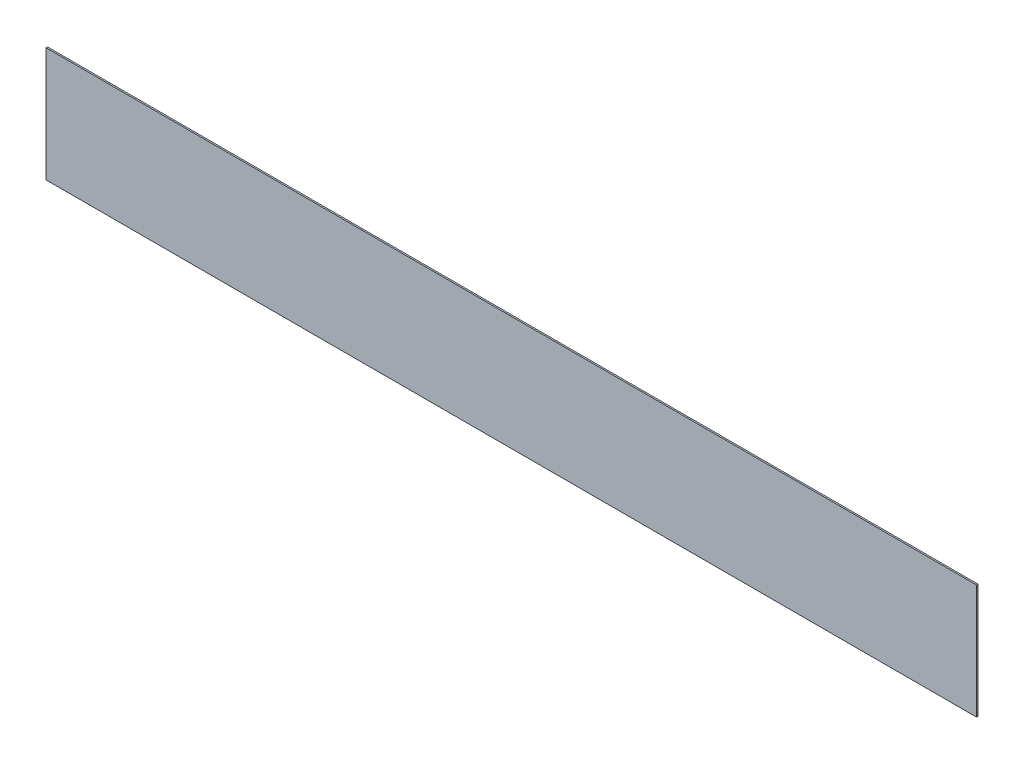
ISO-10303-21;
HEADER;
FILE_DESCRIPTION(('STEP AP214'),'2;1');
FILE_NAME('part.step','',(''),(''),'','','');
FILE_SCHEMA(('AUTOMOTIVE_DESIGN { 1 0 10303 214 1 1 1 1 }'));
ENDSEC;
DATA;
#1=APPLICATION_CONTEXT('core data for automotive mechanical design processes');
#2=APPLICATION_PROTOCOL_DEFINITION('international standard','automotive_design',2000,#1);
#3=PRODUCT_CONTEXT('',#1,'mechanical');
#4=PRODUCT('Part','Part','',(#3));
#5=PRODUCT_RELATED_PRODUCT_CATEGORY('part','',(#4));
#6=PRODUCT_DEFINITION_FORMATION('','',#4);
#7=PRODUCT_DEFINITION_CONTEXT('part definition',#1,'design');
#8=PRODUCT_DEFINITION('design','',#6,#7);
#9=PRODUCT_DEFINITION_SHAPE('','',#8);
#10=(LENGTH_UNIT() NAMED_UNIT(*) SI_UNIT(.MILLI.,.METRE.));
#11=(NAMED_UNIT(*) PLANE_ANGLE_UNIT() SI_UNIT($,.RADIAN.));
#12=(NAMED_UNIT(*) SI_UNIT($,.STERADIAN.) SOLID_ANGLE_UNIT());
#13=UNCERTAINTY_MEASURE_WITH_UNIT(LENGTH_MEASURE(1.E-05),#10,'distance_accuracy_value','');
#14=(GEOMETRIC_REPRESENTATION_CONTEXT(3) GLOBAL_UNCERTAINTY_ASSIGNED_CONTEXT((#13)) GLOBAL_UNIT_ASSIGNED_CONTEXT((#10,
#11,#12)) REPRESENTATION_CONTEXT('',''));
#15=CARTESIAN_POINT('',(0.,0.,0.));
#16=DIRECTION('',(0.,0.,1.));
#17=DIRECTION('',(1.,0.,0.));
#18=AXIS2_PLACEMENT_3D('',#15,#16,#17);
#19=CARTESIAN_POINT('',(0.,0.,1.27));
#20=DIRECTION('',(1.,0.,0.));
#21=DIRECTION('',(0.,0.,-1.));
#22=AXIS2_PLACEMENT_3D('',#19,#20,#21);
#23=PLANE('',#22);
#24=DIRECTION('',(0.,-1.,0.));
#25=VECTOR('',#24,1.);
#26=CARTESIAN_POINT('',(0.,0.,0.));
#27=LINE('',#26,#25);
#28=CARTESIAN_POINT('',(0.,100.,0.));
#29=VERTEX_POINT('',#28);
#30=CARTESIAN_POINT('',(0.,0.,0.));
#31=VERTEX_POINT('',#30);
#32=EDGE_CURVE('E102',#29,#31,#27,.T.);
#33=ORIENTED_EDGE('',*,*,#32,.T.);
#34=DIRECTION('',(0.,0.,-1.));
#35=VECTOR('',#34,1.);
#36=CARTESIAN_POINT('',(0.,0.,1.27));
#37=LINE('',#36,#35);
#38=CARTESIAN_POINT('',(0.,0.,1.27));
#39=VERTEX_POINT('',#38);
#40=EDGE_CURVE('E11',#39,#31,#37,.T.);
#41=ORIENTED_EDGE('',*,*,#40,.F.);
#42=DIRECTION('',(0.,-1.,0.));
#43=VECTOR('',#42,1.);
#44=CARTESIAN_POINT('',(0.,0.,1.27));
#45=LINE('',#44,#43);
#46=CARTESIAN_POINT('',(0.,100.,1.27));
#47=VERTEX_POINT('',#46);
#48=EDGE_CURVE('E90',#47,#39,#45,.T.);
#49=ORIENTED_EDGE('',*,*,#48,.F.);
#50=DIRECTION('',(0.,0.,-1.));
#51=VECTOR('',#50,1.);
#52=CARTESIAN_POINT('',(0.,100.,1.27));
#53=LINE('',#52,#51);
#54=EDGE_CURVE('E98',#47,#29,#53,.T.);
#55=ORIENTED_EDGE('',*,*,#54,.T.);
#56=EDGE_LOOP('',(#33,#41,#49,#55));
#57=FACE_BOUND('',#56,.T.);
#58=ADVANCED_FACE('F39',(#57),#23,.F.);
#59=CARTESIAN_POINT('',(0.,0.,1.27));
#60=DIRECTION('',(0.,1.,0.));
#61=DIRECTION('',(0.,0.,1.));
#62=AXIS2_PLACEMENT_3D('',#59,#60,#61);
#63=PLANE('',#62);
#64=DIRECTION('',(1.,0.,0.));
#65=VECTOR('',#64,1.);
#66=CARTESIAN_POINT('',(0.,0.,0.));
#67=LINE('',#66,#65);
#68=CARTESIAN_POINT('',(813.,0.,0.));
#69=VERTEX_POINT('',#68);
#70=EDGE_CURVE('E94',#31,#69,#67,.T.);
#71=ORIENTED_EDGE('',*,*,#70,.T.);
#72=DIRECTION('',(0.,0.,-1.));
#73=VECTOR('',#72,1.);
#74=CARTESIAN_POINT('',(813.,0.,1.27));
#75=LINE('',#74,#73);
#76=CARTESIAN_POINT('',(813.,0.,1.27));
#77=VERTEX_POINT('',#76);
#78=EDGE_CURVE('E47',#77,#69,#75,.T.);
#79=ORIENTED_EDGE('',*,*,#78,.F.);
#80=DIRECTION('',(1.,0.,0.));
#81=VECTOR('',#80,1.);
#82=CARTESIAN_POINT('',(0.,0.,1.27));
#83=LINE('',#82,#81);
#84=EDGE_CURVE('E85',#39,#77,#83,.T.);
#85=ORIENTED_EDGE('',*,*,#84,.F.);
#86=ORIENTED_EDGE('',*,*,#40,.T.);
#87=EDGE_LOOP('',(#71,#79,#85,#86));
#88=FACE_BOUND('',#87,.T.);
#89=ADVANCED_FACE('F93',(#88),#63,.F.);
#90=CARTESIAN_POINT('',(813.,0.,1.27));
#91=DIRECTION('',(-1.,0.,0.));
#92=DIRECTION('',(0.,0.,1.));
#93=AXIS2_PLACEMENT_3D('',#90,#91,#92);
#94=PLANE('',#93);
#95=DIRECTION('',(0.,1.,0.));
#96=VECTOR('',#95,1.);
#97=CARTESIAN_POINT('',(813.,0.,0.));
#98=LINE('',#97,#96);
#99=CARTESIAN_POINT('',(813.,100.,0.));
#100=VERTEX_POINT('',#99);
#101=EDGE_CURVE('E72',#69,#100,#98,.T.);
#102=ORIENTED_EDGE('',*,*,#101,.T.);
#103=DIRECTION('',(0.,0.,-1.));
#104=VECTOR('',#103,1.);
#105=CARTESIAN_POINT('',(813.,100.,1.27));
#106=LINE('',#105,#104);
#107=CARTESIAN_POINT('',(813.,100.,1.27));
#108=VERTEX_POINT('',#107);
#109=EDGE_CURVE('E95',#108,#100,#106,.T.);
#110=ORIENTED_EDGE('',*,*,#109,.F.);
#111=DIRECTION('',(0.,1.,0.));
#112=VECTOR('',#111,1.);
#113=CARTESIAN_POINT('',(813.,0.,1.27));
#114=LINE('',#113,#112);
#115=EDGE_CURVE('E88',#77,#108,#114,.T.);
#116=ORIENTED_EDGE('',*,*,#115,.F.);
#117=ORIENTED_EDGE('',*,*,#78,.T.);
#118=EDGE_LOOP('',(#102,#110,#116,#117));
#119=FACE_BOUND('',#118,.T.);
#120=ADVANCED_FACE('F96',(#119),#94,.F.);
#121=CARTESIAN_POINT('',(0.,100.,1.27));
#122=DIRECTION('',(0.,-1.,0.));
#123=DIRECTION('',(0.,0.,-1.));
#124=AXIS2_PLACEMENT_3D('',#121,#122,#123);
#125=PLANE('',#124);
#126=DIRECTION('',(-1.,0.,0.));
#127=VECTOR('',#126,1.);
#128=CARTESIAN_POINT('',(0.,100.,0.));
#129=LINE('',#128,#127);
#130=EDGE_CURVE('E78',#100,#29,#129,.T.);
#131=ORIENTED_EDGE('',*,*,#130,.T.);
#132=ORIENTED_EDGE('',*,*,#54,.F.);
#133=DIRECTION('',(-1.,0.,0.));
#134=VECTOR('',#133,1.);
#135=CARTESIAN_POINT('',(0.,100.,1.27));
#136=LINE('',#135,#134);
#137=EDGE_CURVE('E55',#108,#47,#136,.T.);
#138=ORIENTED_EDGE('',*,*,#137,.F.);
#139=ORIENTED_EDGE('',*,*,#109,.T.);
#140=EDGE_LOOP('',(#131,#132,#138,#139));
#141=FACE_BOUND('',#140,.T.);
#142=ADVANCED_FACE('F109',(#141),#125,.F.);
#143=CARTESIAN_POINT('',(0.,0.,1.27));
#144=DIRECTION('',(0.,0.,-1.));
#145=DIRECTION('',(-1.,0.,0.));
#146=AXIS2_PLACEMENT_3D('',#143,#144,#145);
#147=PLANE('',#146);
#148=ORIENTED_EDGE('',*,*,#48,.T.);
#149=ORIENTED_EDGE('',*,*,#84,.T.);
#150=ORIENTED_EDGE('',*,*,#115,.T.);
#151=ORIENTED_EDGE('',*,*,#137,.T.);
#152=EDGE_LOOP('',(#148,#149,#150,#151));
#153=FACE_BOUND('',#152,.T.);
#154=ADVANCED_FACE('F86',(#153),#147,.F.);
#155=CARTESIAN_POINT('',(0.,0.,0.));
#156=DIRECTION('',(0.,0.,-1.));
#157=DIRECTION('',(-1.,0.,0.));
#158=AXIS2_PLACEMENT_3D('',#155,#156,#157);
#159=PLANE('',#158);
#160=ORIENTED_EDGE('',*,*,#32,.F.);
#161=ORIENTED_EDGE('',*,*,#130,.F.);
#162=ORIENTED_EDGE('',*,*,#101,.F.);
#163=ORIENTED_EDGE('',*,*,#70,.F.);
#164=EDGE_LOOP('',(#160,#161,#162,#163));
#165=FACE_BOUND('',#164,.T.);
#166=ADVANCED_FACE('F112',(#165),#159,.T.);
#167=CLOSED_SHELL('',(#58,#89,#120,#142,#154,#166));
#168=MANIFOLD_SOLID_BREP('B2',#167);
#169=ADVANCED_BREP_SHAPE_REPRESENTATION('',(#18,#168),#14);
#170=SHAPE_DEFINITION_REPRESENTATION(#9,#169);
ENDSEC;
END-ISO-10303-21;
